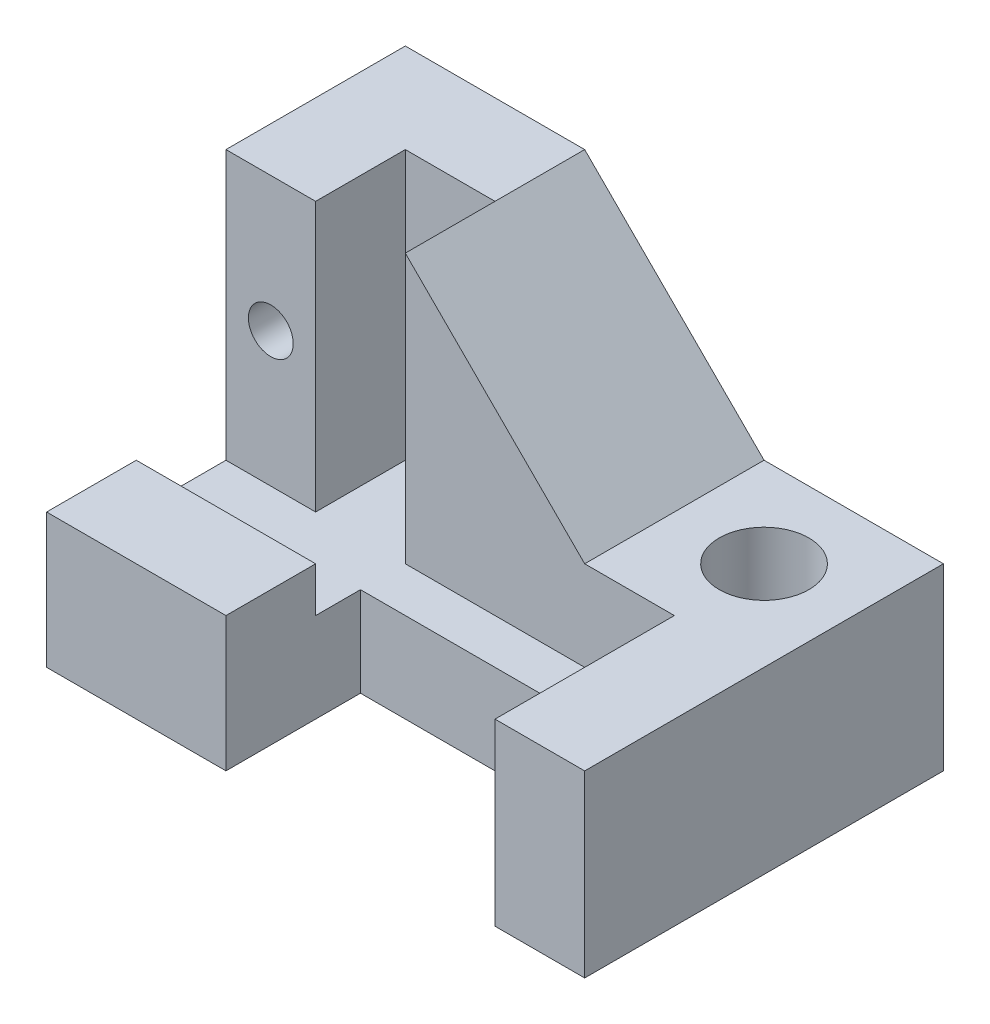
ISO-10303-21;
HEADER;
FILE_DESCRIPTION(('STEP AP214'),'2;1');
FILE_NAME('part.step','',(''),(''),'','','');
FILE_SCHEMA(('AUTOMOTIVE_DESIGN { 1 0 10303 214 1 1 1 1 }'));
ENDSEC;
DATA;
#1=APPLICATION_CONTEXT('core data for automotive mechanical design processes');
#2=APPLICATION_PROTOCOL_DEFINITION('international standard','automotive_design',2000,#1);
#3=PRODUCT_CONTEXT('',#1,'mechanical');
#4=PRODUCT('Part','Part','',(#3));
#5=PRODUCT_RELATED_PRODUCT_CATEGORY('part','',(#4));
#6=PRODUCT_DEFINITION_FORMATION('','',#4);
#7=PRODUCT_DEFINITION_CONTEXT('part definition',#1,'design');
#8=PRODUCT_DEFINITION('design','',#6,#7);
#9=PRODUCT_DEFINITION_SHAPE('','',#8);
#10=(LENGTH_UNIT() NAMED_UNIT(*) SI_UNIT(.MILLI.,.METRE.));
#11=(NAMED_UNIT(*) PLANE_ANGLE_UNIT() SI_UNIT($,.RADIAN.));
#12=(NAMED_UNIT(*) SI_UNIT($,.STERADIAN.) SOLID_ANGLE_UNIT());
#13=UNCERTAINTY_MEASURE_WITH_UNIT(LENGTH_MEASURE(1.E-05),#10,'distance_accuracy_value','');
#14=(GEOMETRIC_REPRESENTATION_CONTEXT(3) GLOBAL_UNCERTAINTY_ASSIGNED_CONTEXT((#13)) GLOBAL_UNIT_ASSIGNED_CONTEXT((#10,
#11,#12)) REPRESENTATION_CONTEXT('',''));
#15=CARTESIAN_POINT('',(0.,0.,0.));
#16=DIRECTION('',(0.,0.,1.));
#17=DIRECTION('',(1.,0.,0.));
#18=AXIS2_PLACEMENT_3D('',#15,#16,#17);
#19=CARTESIAN_POINT('',(0.,0.5,0.));
#20=DIRECTION('',(0.,0.,-1.));
#21=DIRECTION('',(-1.,0.,0.));
#22=AXIS2_PLACEMENT_3D('',#19,#20,#21);
#23=PLANE('',#22);
#24=DIRECTION('',(0.,1.,0.));
#25=VECTOR('',#24,1.);
#26=CARTESIAN_POINT('',(1.,0.,0.));
#27=LINE('',#26,#25);
#28=CARTESIAN_POINT('',(1.,0.,0.));
#29=VERTEX_POINT('',#28);
#30=CARTESIAN_POINT('',(1.,0.75,0.));
#31=VERTEX_POINT('',#30);
#32=EDGE_CURVE('E289',#29,#31,#27,.T.);
#33=ORIENTED_EDGE('',*,*,#32,.T.);
#34=DIRECTION('',(1.,0.,0.));
#35=VECTOR('',#34,1.);
#36=CARTESIAN_POINT('',(0.,0.75,0.));
#37=LINE('',#36,#35);
#38=CARTESIAN_POINT('',(0.,0.75,0.));
#39=VERTEX_POINT('',#38);
#40=EDGE_CURVE('E263',#39,#31,#37,.T.);
#41=ORIENTED_EDGE('',*,*,#40,.F.);
#42=DIRECTION('',(0.,-1.,0.));
#43=VECTOR('',#42,1.);
#44=CARTESIAN_POINT('',(0.,0.5,0.));
#45=LINE('',#44,#43);
#46=CARTESIAN_POINT('',(0.,0.,0.));
#47=VERTEX_POINT('',#46);
#48=EDGE_CURVE('E48',#39,#47,#45,.T.);
#49=ORIENTED_EDGE('',*,*,#48,.T.);
#50=DIRECTION('',(1.,0.,0.));
#51=VECTOR('',#50,1.);
#52=CARTESIAN_POINT('',(0.,0.,0.));
#53=LINE('',#52,#51);
#54=EDGE_CURVE('E318',#47,#29,#53,.T.);
#55=ORIENTED_EDGE('',*,*,#54,.T.);
#56=EDGE_LOOP('',(#33,#41,#49,#55));
#57=FACE_BOUND('',#56,.T.);
#58=ADVANCED_FACE('F39',(#57),#23,.F.);
#59=CARTESIAN_POINT('',(0.,0.5,0.));
#60=DIRECTION('',(0.,-1.,0.));
#61=DIRECTION('',(0.,0.,-1.));
#62=AXIS2_PLACEMENT_3D('',#59,#60,#61);
#63=PLANE('',#62);
#64=DIRECTION('',(-1.,0.,0.));
#65=VECTOR('',#64,1.);
#66=CARTESIAN_POINT('',(0.,0.5,-0.75));
#67=LINE('',#66,#65);
#68=CARTESIAN_POINT('',(2.5,0.5,-0.75));
#69=VERTEX_POINT('',#68);
#70=CARTESIAN_POINT('',(1.,0.5,-0.75));
#71=VERTEX_POINT('',#70);
#72=EDGE_CURVE('E292',#69,#71,#67,.T.);
#73=ORIENTED_EDGE('',*,*,#72,.F.);
#74=DIRECTION('',(0.,0.,-1.));
#75=VECTOR('',#74,1.);
#76=CARTESIAN_POINT('',(2.5,0.5,0.));
#77=LINE('',#76,#75);
#78=CARTESIAN_POINT('',(2.5,0.5,-1.));
#79=VERTEX_POINT('',#78);
#80=EDGE_CURVE('E219',#69,#79,#77,.T.);
#81=ORIENTED_EDGE('',*,*,#80,.T.);
#82=DIRECTION('',(1.,0.,0.));
#83=VECTOR('',#82,1.);
#84=CARTESIAN_POINT('',(0.,0.5,-1.));
#85=LINE('',#84,#83);
#86=CARTESIAN_POINT('',(1.,0.5,-1.));
#87=VERTEX_POINT('',#86);
#88=EDGE_CURVE('E62',#87,#79,#85,.T.);
#89=ORIENTED_EDGE('',*,*,#88,.F.);
#90=DIRECTION('',(0.,0.,1.));
#91=VECTOR('',#90,1.);
#92=CARTESIAN_POINT('',(1.,0.5,0.));
#93=LINE('',#92,#91);
#94=CARTESIAN_POINT('',(1.,0.5,-1.5));
#95=VERTEX_POINT('',#94);
#96=EDGE_CURVE('E213',#95,#87,#93,.T.);
#97=ORIENTED_EDGE('',*,*,#96,.F.);
#98=DIRECTION('',(1.,0.,0.));
#99=VECTOR('',#98,1.);
#100=CARTESIAN_POINT('',(0.,0.5,-1.5));
#101=LINE('',#100,#99);
#102=CARTESIAN_POINT('',(0.5,0.5,-1.5));
#103=VERTEX_POINT('',#102);
#104=EDGE_CURVE('E209',#103,#95,#101,.T.);
#105=ORIENTED_EDGE('',*,*,#104,.F.);
#106=DIRECTION('',(0.,0.,-1.));
#107=VECTOR('',#106,1.);
#108=CARTESIAN_POINT('',(0.5,0.5,0.));
#109=LINE('',#108,#107);
#110=CARTESIAN_POINT('',(0.5,0.5,-1.));
#111=VERTEX_POINT('',#110);
#112=EDGE_CURVE('E226',#111,#103,#109,.T.);
#113=ORIENTED_EDGE('',*,*,#112,.F.);
#114=DIRECTION('',(1.,0.,0.));
#115=VECTOR('',#114,1.);
#116=CARTESIAN_POINT('',(0.,0.5,-1.));
#117=LINE('',#116,#115);
#118=CARTESIAN_POINT('',(0.,0.5,-1.));
#119=VERTEX_POINT('',#118);
#120=EDGE_CURVE('E222',#119,#111,#117,.T.);
#121=ORIENTED_EDGE('',*,*,#120,.F.);
#122=DIRECTION('',(0.,0.,1.));
#123=VECTOR('',#122,1.);
#124=CARTESIAN_POINT('',(0.,0.5,0.));
#125=LINE('',#124,#123);
#126=CARTESIAN_POINT('',(0.,0.5,-0.5));
#127=VERTEX_POINT('',#126);
#128=EDGE_CURVE('E310',#119,#127,#125,.T.);
#129=ORIENTED_EDGE('',*,*,#128,.T.);
#130=DIRECTION('',(1.,0.,0.));
#131=VECTOR('',#130,1.);
#132=CARTESIAN_POINT('',(0.,0.5,-0.5));
#133=LINE('',#132,#131);
#134=CARTESIAN_POINT('',(1.,0.5,-0.5));
#135=VERTEX_POINT('',#134);
#136=EDGE_CURVE('E251',#127,#135,#133,.T.);
#137=ORIENTED_EDGE('',*,*,#136,.T.);
#138=DIRECTION('',(0.,0.,1.));
#139=VECTOR('',#138,1.);
#140=CARTESIAN_POINT('',(1.,0.5,0.));
#141=LINE('',#140,#139);
#142=EDGE_CURVE('E305',#71,#135,#141,.T.);
#143=ORIENTED_EDGE('',*,*,#142,.F.);
#144=EDGE_LOOP('',(#73,#81,#89,#97,#105,#113,#121,#129,#137,#143));
#145=FACE_BOUND('',#144,.T.);
#146=ADVANCED_FACE('F356',(#145),#63,.F.);
#147=CARTESIAN_POINT('',(0.,0.,0.));
#148=DIRECTION('',(0.,-1.,0.));
#149=DIRECTION('',(0.,0.,-1.));
#150=AXIS2_PLACEMENT_3D('',#147,#148,#149);
#151=PLANE('',#150);
#152=CARTESIAN_POINT('',(2.5,0.,-1.5));
#153=DIRECTION('',(0.,1.,0.));
#154=DIRECTION('',(0.,0.,1.));
#155=AXIS2_PLACEMENT_3D('',#152,#153,#154);
#156=CIRCLE('',#155,0.25);
#157=CARTESIAN_POINT('',(2.5,0.,-1.25));
#158=VERTEX_POINT('',#157);
#159=EDGE_CURVE('E446',#158,#158,#156,.T.);
#160=ORIENTED_EDGE('',*,*,#159,.T.);
#161=EDGE_LOOP('',(#160));
#162=FACE_BOUND('',#161,.T.);
#163=DIRECTION('',(1.,0.,0.));
#164=VECTOR('',#163,1.);
#165=CARTESIAN_POINT('',(0.,0.,-0.75));
#166=LINE('',#165,#164);
#167=CARTESIAN_POINT('',(1.,0.,-0.75));
#168=VERTEX_POINT('',#167);
#169=CARTESIAN_POINT('',(2.5,0.,-0.75));
#170=VERTEX_POINT('',#169);
#171=EDGE_CURVE('E281',#168,#170,#166,.T.);
#172=ORIENTED_EDGE('',*,*,#171,.F.);
#173=DIRECTION('',(0.,0.,-1.));
#174=VECTOR('',#173,1.);
#175=CARTESIAN_POINT('',(1.,0.,0.));
#176=LINE('',#175,#174);
#177=EDGE_CURVE('E285',#29,#168,#176,.T.);
#178=ORIENTED_EDGE('',*,*,#177,.F.);
#179=ORIENTED_EDGE('',*,*,#54,.F.);
#180=DIRECTION('',(0.,0.,1.));
#181=VECTOR('',#180,1.);
#182=CARTESIAN_POINT('',(0.,0.,0.));
#183=LINE('',#182,#181);
#184=CARTESIAN_POINT('',(0.,0.,-2.));
#185=VERTEX_POINT('',#184);
#186=EDGE_CURVE('E309',#185,#47,#183,.T.);
#187=ORIENTED_EDGE('',*,*,#186,.F.);
#188=DIRECTION('',(-1.,0.,0.));
#189=VECTOR('',#188,1.);
#190=CARTESIAN_POINT('',(0.,0.,-2.));
#191=LINE('',#190,#189);
#192=CARTESIAN_POINT('',(3.,0.,-2.));
#193=VERTEX_POINT('',#192);
#194=EDGE_CURVE('E313',#193,#185,#191,.T.);
#195=ORIENTED_EDGE('',*,*,#194,.F.);
#196=DIRECTION('',(0.,0.,-1.));
#197=VECTOR('',#196,1.);
#198=CARTESIAN_POINT('',(3.,0.,0.));
#199=LINE('',#198,#197);
#200=CARTESIAN_POINT('',(3.,0.,0.));
#201=VERTEX_POINT('',#200);
#202=EDGE_CURVE('E322',#201,#193,#199,.T.);
#203=ORIENTED_EDGE('',*,*,#202,.F.);
#204=CARTESIAN_POINT('',(2.5,0.,0.));
#205=VERTEX_POINT('',#204);
#206=EDGE_CURVE('E317',#205,#201,#53,.T.);
#207=ORIENTED_EDGE('',*,*,#206,.F.);
#208=DIRECTION('',(0.,0.,-1.));
#209=VECTOR('',#208,1.);
#210=CARTESIAN_POINT('',(2.5,0.,0.));
#211=LINE('',#210,#209);
#212=EDGE_CURVE('E277',#205,#170,#211,.T.);
#213=ORIENTED_EDGE('',*,*,#212,.T.);
#214=EDGE_LOOP('',(#172,#178,#179,#187,#195,#203,#207,#213));
#215=FACE_BOUND('',#214,.T.);
#216=ADVANCED_FACE('F345',(#162,#215),#151,.T.);
#217=CARTESIAN_POINT('',(0.,0.5,0.));
#218=DIRECTION('',(1.,0.,0.));
#219=DIRECTION('',(0.,0.,-1.));
#220=AXIS2_PLACEMENT_3D('',#217,#218,#219);
#221=PLANE('',#220);
#222=ORIENTED_EDGE('',*,*,#186,.T.);
#223=ORIENTED_EDGE('',*,*,#48,.F.);
#224=DIRECTION('',(0.,0.,-1.));
#225=VECTOR('',#224,1.);
#226=CARTESIAN_POINT('',(0.,0.75,0.));
#227=LINE('',#226,#225);
#228=CARTESIAN_POINT('',(0.,0.75,-0.5));
#229=VERTEX_POINT('',#228);
#230=EDGE_CURVE('E259',#39,#229,#227,.T.);
#231=ORIENTED_EDGE('',*,*,#230,.T.);
#232=DIRECTION('',(0.,-1.,0.));
#233=VECTOR('',#232,1.);
#234=CARTESIAN_POINT('',(0.,0.75,-0.5));
#235=LINE('',#234,#233);
#236=EDGE_CURVE('E267',#229,#127,#235,.T.);
#237=ORIENTED_EDGE('',*,*,#236,.T.);
#238=ORIENTED_EDGE('',*,*,#128,.F.);
#239=DIRECTION('',(0.,-1.,0.));
#240=VECTOR('',#239,1.);
#241=CARTESIAN_POINT('',(0.,2.,-1.));
#242=LINE('',#241,#240);
#243=CARTESIAN_POINT('',(0.,2.,-1.));
#244=VERTEX_POINT('',#243);
#245=EDGE_CURVE('E237',#244,#119,#242,.T.);
#246=ORIENTED_EDGE('',*,*,#245,.F.);
#247=DIRECTION('',(0.,0.,1.));
#248=VECTOR('',#247,1.);
#249=CARTESIAN_POINT('',(0.,2.,0.));
#250=LINE('',#249,#248);
#251=CARTESIAN_POINT('',(0.,2.,-2.));
#252=VERTEX_POINT('',#251);
#253=EDGE_CURVE('E193',#252,#244,#250,.T.);
#254=ORIENTED_EDGE('',*,*,#253,.F.);
#255=DIRECTION('',(0.,-1.,0.));
#256=VECTOR('',#255,1.);
#257=CARTESIAN_POINT('',(0.,0.5,-2.));
#258=LINE('',#257,#256);
#259=EDGE_CURVE('E190',#252,#185,#258,.T.);
#260=ORIENTED_EDGE('',*,*,#259,.T.);
#261=EDGE_LOOP('',(#222,#223,#231,#237,#238,#246,#254,#260));
#262=FACE_BOUND('',#261,.T.);
#263=ADVANCED_FACE('F41',(#262),#221,.F.);
#264=DIRECTION('',(0.,-1.,0.));
#265=VECTOR('',#264,1.);
#266=CARTESIAN_POINT('',(3.,0.5,0.));
#267=LINE('',#266,#265);
#268=CARTESIAN_POINT('',(3.,1.00000000000003,0.));
#269=VERTEX_POINT('',#268);
#270=EDGE_CURVE('E333',#269,#201,#267,.T.);
#271=ORIENTED_EDGE('',*,*,#270,.F.);
#272=DIRECTION('',(1.,0.,0.));
#273=VECTOR('',#272,1.);
#274=CARTESIAN_POINT('',(2.,1.00000000000003,0.));
#275=LINE('',#274,#273);
#276=CARTESIAN_POINT('',(2.5,1.00000000000003,0.));
#277=VERTEX_POINT('',#276);
#278=EDGE_CURVE('E176',#277,#269,#275,.T.);
#279=ORIENTED_EDGE('',*,*,#278,.F.);
#280=DIRECTION('',(0.,1.,0.));
#281=VECTOR('',#280,1.);
#282=CARTESIAN_POINT('',(2.5,0.,0.));
#283=LINE('',#282,#281);
#284=EDGE_CURVE('E288',#205,#277,#283,.T.);
#285=ORIENTED_EDGE('',*,*,#284,.F.);
#286=ORIENTED_EDGE('',*,*,#206,.T.);
#287=EDGE_LOOP('',(#271,#279,#285,#286));
#288=FACE_BOUND('',#287,.T.);
#289=ADVANCED_FACE('F364',(#288),#23,.F.);
#290=CARTESIAN_POINT('',(3.,0.5,0.));
#291=DIRECTION('',(-1.,0.,0.));
#292=DIRECTION('',(0.,0.,1.));
#293=AXIS2_PLACEMENT_3D('',#290,#291,#292);
#294=PLANE('',#293);
#295=DIRECTION('',(0.,-1.,0.));
#296=VECTOR('',#295,1.);
#297=CARTESIAN_POINT('',(3.,0.5,-2.));
#298=LINE('',#297,#296);
#299=CARTESIAN_POINT('',(3.,1.00000000000003,-2.));
#300=VERTEX_POINT('',#299);
#301=EDGE_CURVE('E330',#300,#193,#298,.T.);
#302=ORIENTED_EDGE('',*,*,#301,.F.);
#303=DIRECTION('',(0.,0.,1.));
#304=VECTOR('',#303,1.);
#305=CARTESIAN_POINT('',(3.,1.00000000000003,-2.));
#306=LINE('',#305,#304);
#307=EDGE_CURVE('E370',#300,#269,#306,.T.);
#308=ORIENTED_EDGE('',*,*,#307,.T.);
#309=ORIENTED_EDGE('',*,*,#270,.T.);
#310=ORIENTED_EDGE('',*,*,#202,.T.);
#311=EDGE_LOOP('',(#302,#308,#309,#310));
#312=FACE_BOUND('',#311,.T.);
#313=ADVANCED_FACE('F368',(#312),#294,.F.);
#314=CARTESIAN_POINT('',(0.,0.5,-2.));
#315=DIRECTION('',(0.,0.,1.));
#316=DIRECTION('',(1.,0.,0.));
#317=AXIS2_PLACEMENT_3D('',#314,#315,#316);
#318=PLANE('',#317);
#319=CARTESIAN_POINT('',(0.25,1.25,-2.));
#320=DIRECTION('',(0.,0.,1.));
#321=DIRECTION('',(1.,0.,0.));
#322=AXIS2_PLACEMENT_3D('',#319,#320,#321);
#323=CIRCLE('',#322,0.125);
#324=CARTESIAN_POINT('',(0.375,1.25,-2.));
#325=VERTEX_POINT('',#324);
#326=EDGE_CURVE('E437',#325,#325,#323,.T.);
#327=ORIENTED_EDGE('',*,*,#326,.T.);
#328=EDGE_LOOP('',(#327));
#329=FACE_BOUND('',#328,.T.);
#330=DIRECTION('',(0.707106781186556,-0.707106781186539,0.));
#331=VECTOR('',#330,1.);
#332=CARTESIAN_POINT('',(1.,2.,-2.));
#333=LINE('',#332,#331);
#334=CARTESIAN_POINT('',(1.,2.,-2.));
#335=VERTEX_POINT('',#334);
#336=CARTESIAN_POINT('',(2.,1.00000000000003,-2.));
#337=VERTEX_POINT('',#336);
#338=EDGE_CURVE('E163',#335,#337,#333,.T.);
#339=ORIENTED_EDGE('',*,*,#338,.T.);
#340=DIRECTION('',(1.,0.,0.));
#341=VECTOR('',#340,1.);
#342=CARTESIAN_POINT('',(2.,1.00000000000003,-2.));
#343=LINE('',#342,#341);
#344=EDGE_CURVE('E175',#337,#300,#343,.T.);
#345=ORIENTED_EDGE('',*,*,#344,.T.);
#346=ORIENTED_EDGE('',*,*,#301,.T.);
#347=ORIENTED_EDGE('',*,*,#194,.T.);
#348=ORIENTED_EDGE('',*,*,#259,.F.);
#349=DIRECTION('',(-1.,0.,0.));
#350=VECTOR('',#349,1.);
#351=CARTESIAN_POINT('',(0.,2.,-2.));
#352=LINE('',#351,#350);
#353=EDGE_CURVE('E181',#335,#252,#352,.T.);
#354=ORIENTED_EDGE('',*,*,#353,.F.);
#355=EDGE_LOOP('',(#339,#345,#346,#347,#348,#354));
#356=FACE_BOUND('',#355,.T.);
#357=ADVANCED_FACE('F188',(#329,#356),#318,.F.);
#358=CARTESIAN_POINT('',(1.,0.,0.));
#359=DIRECTION('',(1.,0.,0.));
#360=DIRECTION('',(0.,0.,-1.));
#361=AXIS2_PLACEMENT_3D('',#358,#359,#360);
#362=PLANE('',#361);
#363=ORIENTED_EDGE('',*,*,#142,.T.);
#364=DIRECTION('',(0.,-1.,0.));
#365=VECTOR('',#364,1.);
#366=CARTESIAN_POINT('',(1.,0.75,-0.5));
#367=LINE('',#366,#365);
#368=CARTESIAN_POINT('',(1.,0.75,-0.5));
#369=VERTEX_POINT('',#368);
#370=EDGE_CURVE('E274',#369,#135,#367,.T.);
#371=ORIENTED_EDGE('',*,*,#370,.F.);
#372=DIRECTION('',(0.,0.,-1.));
#373=VECTOR('',#372,1.);
#374=CARTESIAN_POINT('',(1.,0.75,0.));
#375=LINE('',#374,#373);
#376=EDGE_CURVE('E252',#31,#369,#375,.T.);
#377=ORIENTED_EDGE('',*,*,#376,.F.);
#378=ORIENTED_EDGE('',*,*,#32,.F.);
#379=ORIENTED_EDGE('',*,*,#177,.T.);
#380=DIRECTION('',(0.,1.,0.));
#381=VECTOR('',#380,1.);
#382=CARTESIAN_POINT('',(1.,0.,-0.75));
#383=LINE('',#382,#381);
#384=EDGE_CURVE('E293',#168,#71,#383,.T.);
#385=ORIENTED_EDGE('',*,*,#384,.T.);
#386=EDGE_LOOP('',(#363,#371,#377,#378,#379,#385));
#387=FACE_BOUND('',#386,.T.);
#388=ADVANCED_FACE('F350',(#387),#362,.T.);
#389=CARTESIAN_POINT('',(0.,0.,-0.75));
#390=DIRECTION('',(0.,0.,1.));
#391=DIRECTION('',(1.,0.,0.));
#392=AXIS2_PLACEMENT_3D('',#389,#390,#391);
#393=PLANE('',#392);
#394=ORIENTED_EDGE('',*,*,#72,.T.);
#395=ORIENTED_EDGE('',*,*,#384,.F.);
#396=ORIENTED_EDGE('',*,*,#171,.T.);
#397=DIRECTION('',(0.,1.,0.));
#398=VECTOR('',#397,1.);
#399=CARTESIAN_POINT('',(2.5,0.,-0.75));
#400=LINE('',#399,#398);
#401=EDGE_CURVE('E297',#170,#69,#400,.T.);
#402=ORIENTED_EDGE('',*,*,#401,.T.);
#403=EDGE_LOOP('',(#394,#395,#396,#402));
#404=FACE_BOUND('',#403,.T.);
#405=ADVANCED_FACE('F354',(#404),#393,.T.);
#406=CARTESIAN_POINT('',(2.5,0.,0.));
#407=DIRECTION('',(1.,0.,0.));
#408=DIRECTION('',(0.,0.,-1.));
#409=AXIS2_PLACEMENT_3D('',#406,#407,#408);
#410=PLANE('',#409);
#411=ORIENTED_EDGE('',*,*,#284,.T.);
#412=DIRECTION('',(0.,0.,-1.));
#413=VECTOR('',#412,1.);
#414=CARTESIAN_POINT('',(2.5,1.00000000000003,0.));
#415=LINE('',#414,#413);
#416=CARTESIAN_POINT('',(2.5,1.00000000000003,-1.));
#417=VERTEX_POINT('',#416);
#418=EDGE_CURVE('E214',#277,#417,#415,.T.);
#419=ORIENTED_EDGE('',*,*,#418,.T.);
#420=DIRECTION('',(0.,-1.,0.));
#421=VECTOR('',#420,1.);
#422=CARTESIAN_POINT('',(2.5,2.,-1.));
#423=LINE('',#422,#421);
#424=EDGE_CURVE('E55',#417,#79,#423,.T.);
#425=ORIENTED_EDGE('',*,*,#424,.T.);
#426=ORIENTED_EDGE('',*,*,#80,.F.);
#427=ORIENTED_EDGE('',*,*,#401,.F.);
#428=ORIENTED_EDGE('',*,*,#212,.F.);
#429=EDGE_LOOP('',(#411,#419,#425,#426,#427,#428));
#430=FACE_BOUND('',#429,.T.);
#431=ADVANCED_FACE('F357',(#430),#410,.F.);
#432=CARTESIAN_POINT('',(0.,0.75,-0.5));
#433=DIRECTION('',(0.,0.,-1.));
#434=DIRECTION('',(-1.,0.,0.));
#435=AXIS2_PLACEMENT_3D('',#432,#433,#434);
#436=PLANE('',#435);
#437=ORIENTED_EDGE('',*,*,#136,.F.);
#438=ORIENTED_EDGE('',*,*,#236,.F.);
#439=DIRECTION('',(1.,0.,0.));
#440=VECTOR('',#439,1.);
#441=CARTESIAN_POINT('',(0.,0.75,-0.5));
#442=LINE('',#441,#440);
#443=EDGE_CURVE('E255',#229,#369,#442,.T.);
#444=ORIENTED_EDGE('',*,*,#443,.T.);
#445=ORIENTED_EDGE('',*,*,#370,.T.);
#446=EDGE_LOOP('',(#437,#438,#444,#445));
#447=FACE_BOUND('',#446,.T.);
#448=ADVANCED_FACE('F405',(#447),#436,.T.);
#449=CARTESIAN_POINT('',(0.,0.75,0.));
#450=DIRECTION('',(0.,-1.,0.));
#451=DIRECTION('',(0.,0.,-1.));
#452=AXIS2_PLACEMENT_3D('',#449,#450,#451);
#453=PLANE('',#452);
#454=ORIENTED_EDGE('',*,*,#376,.T.);
#455=ORIENTED_EDGE('',*,*,#443,.F.);
#456=ORIENTED_EDGE('',*,*,#230,.F.);
#457=ORIENTED_EDGE('',*,*,#40,.T.);
#458=EDGE_LOOP('',(#454,#455,#456,#457));
#459=FACE_BOUND('',#458,.T.);
#460=ADVANCED_FACE('F398',(#459),#453,.F.);
#461=CARTESIAN_POINT('',(0.,2.,-1.5));
#462=DIRECTION('',(0.,0.,-1.));
#463=DIRECTION('',(-1.,0.,0.));
#464=AXIS2_PLACEMENT_3D('',#461,#462,#463);
#465=PLANE('',#464);
#466=ORIENTED_EDGE('',*,*,#104,.T.);
#467=DIRECTION('',(0.,-1.,0.));
#468=VECTOR('',#467,1.);
#469=CARTESIAN_POINT('',(1.,2.,-1.5));
#470=LINE('',#469,#468);
#471=CARTESIAN_POINT('',(1.,2.,-1.5));
#472=VERTEX_POINT('',#471);
#473=EDGE_CURVE('E247',#472,#95,#470,.T.);
#474=ORIENTED_EDGE('',*,*,#473,.F.);
#475=DIRECTION('',(1.,0.,0.));
#476=VECTOR('',#475,1.);
#477=CARTESIAN_POINT('',(0.,2.,-1.5));
#478=LINE('',#477,#476);
#479=CARTESIAN_POINT('',(0.5,2.,-1.5));
#480=VERTEX_POINT('',#479);
#481=EDGE_CURVE('E184',#480,#472,#478,.T.);
#482=ORIENTED_EDGE('',*,*,#481,.F.);
#483=DIRECTION('',(0.,-1.,0.));
#484=VECTOR('',#483,1.);
#485=CARTESIAN_POINT('',(0.5,2.,-1.5));
#486=LINE('',#485,#484);
#487=EDGE_CURVE('E208',#480,#103,#486,.T.);
#488=ORIENTED_EDGE('',*,*,#487,.T.);
#489=EDGE_LOOP('',(#466,#474,#482,#488));
#490=FACE_BOUND('',#489,.T.);
#491=ADVANCED_FACE('F396',(#490),#465,.F.);
#492=CARTESIAN_POINT('',(1.,2.,0.));
#493=DIRECTION('',(1.,0.,0.));
#494=DIRECTION('',(0.,0.,-1.));
#495=AXIS2_PLACEMENT_3D('',#492,#493,#494);
#496=PLANE('',#495);
#497=ORIENTED_EDGE('',*,*,#96,.T.);
#498=DIRECTION('',(0.,-1.,0.));
#499=VECTOR('',#498,1.);
#500=CARTESIAN_POINT('',(1.,2.,-1.));
#501=LINE('',#500,#499);
#502=CARTESIAN_POINT('',(1.,2.,-1.));
#503=VERTEX_POINT('',#502);
#504=EDGE_CURVE('E243',#503,#87,#501,.T.);
#505=ORIENTED_EDGE('',*,*,#504,.F.);
#506=DIRECTION('',(0.,0.,1.));
#507=VECTOR('',#506,1.);
#508=CARTESIAN_POINT('',(1.,2.,0.));
#509=LINE('',#508,#507);
#510=EDGE_CURVE('E194',#472,#503,#509,.T.);
#511=ORIENTED_EDGE('',*,*,#510,.F.);
#512=ORIENTED_EDGE('',*,*,#473,.T.);
#513=EDGE_LOOP('',(#497,#505,#511,#512));
#514=FACE_BOUND('',#513,.T.);
#515=ADVANCED_FACE('F389',(#514),#496,.F.);
#516=CARTESIAN_POINT('',(0.,2.,-1.));
#517=DIRECTION('',(0.,0.,-1.));
#518=DIRECTION('',(-1.,0.,0.));
#519=AXIS2_PLACEMENT_3D('',#516,#517,#518);
#520=PLANE('',#519);
#521=ORIENTED_EDGE('',*,*,#424,.F.);
#522=DIRECTION('',(-1.,0.,0.));
#523=VECTOR('',#522,1.);
#524=CARTESIAN_POINT('',(0.,1.00000000000003,-1.));
#525=LINE('',#524,#523);
#526=CARTESIAN_POINT('',(2.,1.00000000000003,-1.));
#527=VERTEX_POINT('',#526);
#528=EDGE_CURVE('E11',#417,#527,#525,.T.);
#529=ORIENTED_EDGE('',*,*,#528,.T.);
#530=DIRECTION('',(-0.707106781186556,0.707106781186539,0.));
#531=VECTOR('',#530,1.);
#532=CARTESIAN_POINT('',(0.499999999999988,2.5,-1.));
#533=LINE('',#532,#531);
#534=EDGE_CURVE('E373',#527,#503,#533,.T.);
#535=ORIENTED_EDGE('',*,*,#534,.T.);
#536=ORIENTED_EDGE('',*,*,#504,.T.);
#537=ORIENTED_EDGE('',*,*,#88,.T.);
#538=EDGE_LOOP('',(#521,#529,#535,#536,#537));
#539=FACE_BOUND('',#538,.T.);
#540=ADVANCED_FACE('F386',(#539),#520,.F.);
#541=CARTESIAN_POINT('',(0.,2.,-1.));
#542=DIRECTION('',(0.,0.,-1.));
#543=DIRECTION('',(-1.,0.,0.));
#544=AXIS2_PLACEMENT_3D('',#541,#542,#543);
#545=PLANE('',#544);
#546=CARTESIAN_POINT('',(0.25,1.25,-1.));
#547=DIRECTION('',(0.,0.,1.));
#548=DIRECTION('',(1.,0.,0.));
#549=AXIS2_PLACEMENT_3D('',#546,#547,#548);
#550=CIRCLE('',#549,0.125);
#551=CARTESIAN_POINT('',(0.375,1.25,-1.));
#552=VERTEX_POINT('',#551);
#553=EDGE_CURVE('E441',#552,#552,#550,.T.);
#554=ORIENTED_EDGE('',*,*,#553,.F.);
#555=EDGE_LOOP('',(#554));
#556=FACE_BOUND('',#555,.T.);
#557=ORIENTED_EDGE('',*,*,#120,.T.);
#558=DIRECTION('',(0.,-1.,0.));
#559=VECTOR('',#558,1.);
#560=CARTESIAN_POINT('',(0.5,2.,-1.));
#561=LINE('',#560,#559);
#562=CARTESIAN_POINT('',(0.5,2.,-1.));
#563=VERTEX_POINT('',#562);
#564=EDGE_CURVE('E233',#563,#111,#561,.T.);
#565=ORIENTED_EDGE('',*,*,#564,.F.);
#566=DIRECTION('',(1.,0.,0.));
#567=VECTOR('',#566,1.);
#568=CARTESIAN_POINT('',(0.,2.,-1.));
#569=LINE('',#568,#567);
#570=EDGE_CURVE('E198',#244,#563,#569,.T.);
#571=ORIENTED_EDGE('',*,*,#570,.F.);
#572=ORIENTED_EDGE('',*,*,#245,.T.);
#573=EDGE_LOOP('',(#557,#565,#571,#572));
#574=FACE_BOUND('',#573,.T.);
#575=ADVANCED_FACE('F470',(#556,#574),#545,.F.);
#576=CARTESIAN_POINT('',(0.5,2.,0.));
#577=DIRECTION('',(-1.,0.,0.));
#578=DIRECTION('',(0.,0.,1.));
#579=AXIS2_PLACEMENT_3D('',#576,#577,#578);
#580=PLANE('',#579);
#581=ORIENTED_EDGE('',*,*,#112,.T.);
#582=ORIENTED_EDGE('',*,*,#487,.F.);
#583=DIRECTION('',(0.,0.,-1.));
#584=VECTOR('',#583,1.);
#585=CARTESIAN_POINT('',(0.5,2.,0.));
#586=LINE('',#585,#584);
#587=EDGE_CURVE('E205',#563,#480,#586,.T.);
#588=ORIENTED_EDGE('',*,*,#587,.F.);
#589=ORIENTED_EDGE('',*,*,#564,.T.);
#590=EDGE_LOOP('',(#581,#582,#588,#589));
#591=FACE_BOUND('',#590,.T.);
#592=ADVANCED_FACE('F393',(#591),#580,.F.);
#593=CARTESIAN_POINT('',(0.,2.,0.));
#594=DIRECTION('',(0.,1.,0.));
#595=DIRECTION('',(0.,0.,1.));
#596=AXIS2_PLACEMENT_3D('',#593,#594,#595);
#597=PLANE('',#596);
#598=DIRECTION('',(0.,0.,1.));
#599=VECTOR('',#598,1.);
#600=CARTESIAN_POINT('',(1.,2.,-2.));
#601=LINE('',#600,#599);
#602=EDGE_CURVE('E166',#335,#472,#601,.T.);
#603=ORIENTED_EDGE('',*,*,#602,.F.);
#604=ORIENTED_EDGE('',*,*,#353,.T.);
#605=ORIENTED_EDGE('',*,*,#253,.T.);
#606=ORIENTED_EDGE('',*,*,#570,.T.);
#607=ORIENTED_EDGE('',*,*,#587,.T.);
#608=ORIENTED_EDGE('',*,*,#481,.T.);
#609=EDGE_LOOP('',(#603,#604,#605,#606,#607,#608));
#610=FACE_BOUND('',#609,.T.);
#611=ADVANCED_FACE('F180',(#610),#597,.T.);
#612=CARTESIAN_POINT('',(2.,1.00000000000003,-2.));
#613=DIRECTION('',(0.,-1.,0.));
#614=DIRECTION('',(0.,0.,-1.));
#615=AXIS2_PLACEMENT_3D('',#612,#613,#614);
#616=PLANE('',#615);
#617=CARTESIAN_POINT('',(2.5,1.00000000000003,-1.5));
#618=DIRECTION('',(0.,1.,0.));
#619=DIRECTION('',(0.,0.,1.));
#620=AXIS2_PLACEMENT_3D('',#617,#618,#619);
#621=CIRCLE('',#620,0.25);
#622=CARTESIAN_POINT('',(2.5,1.00000000000003,-1.25));
#623=VERTEX_POINT('',#622);
#624=EDGE_CURVE('E440',#623,#623,#621,.T.);
#625=ORIENTED_EDGE('',*,*,#624,.F.);
#626=EDGE_LOOP('',(#625));
#627=FACE_BOUND('',#626,.T.);
#628=ORIENTED_EDGE('',*,*,#278,.T.);
#629=ORIENTED_EDGE('',*,*,#307,.F.);
#630=ORIENTED_EDGE('',*,*,#344,.F.);
#631=DIRECTION('',(0.,0.,1.));
#632=VECTOR('',#631,1.);
#633=CARTESIAN_POINT('',(2.,1.00000000000003,-2.));
#634=LINE('',#633,#632);
#635=EDGE_CURVE('E169',#337,#527,#634,.T.);
#636=ORIENTED_EDGE('',*,*,#635,.T.);
#637=ORIENTED_EDGE('',*,*,#528,.F.);
#638=ORIENTED_EDGE('',*,*,#418,.F.);
#639=EDGE_LOOP('',(#628,#629,#630,#636,#637,#638));
#640=FACE_BOUND('',#639,.T.);
#641=ADVANCED_FACE('F453',(#627,#640),#616,.F.);
#642=CARTESIAN_POINT('',(1.,2.,-2.));
#643=DIRECTION('',(-0.707106781186539,-0.707106781186556,0.));
#644=DIRECTION('',(0.707106781186556,-0.707106781186539,0.));
#645=AXIS2_PLACEMENT_3D('',#642,#643,#644);
#646=PLANE('',#645);
#647=ORIENTED_EDGE('',*,*,#635,.F.);
#648=ORIENTED_EDGE('',*,*,#338,.F.);
#649=ORIENTED_EDGE('',*,*,#602,.T.);
#650=ORIENTED_EDGE('',*,*,#510,.T.);
#651=ORIENTED_EDGE('',*,*,#534,.F.);
#652=EDGE_LOOP('',(#647,#648,#649,#650,#651));
#653=FACE_BOUND('',#652,.T.);
#654=ADVANCED_FACE('F165',(#653),#646,.F.);
#655=CARTESIAN_POINT('',(2.5,0.,-1.5));
#656=DIRECTION('',(0.,1.,0.));
#657=DIRECTION('',(0.,0.,1.));
#658=AXIS2_PLACEMENT_3D('',#655,#656,#657);
#659=CYLINDRICAL_SURFACE('',#658,0.25);
#660=ORIENTED_EDGE('',*,*,#159,.F.);
#661=EDGE_LOOP('',(#660));
#662=FACE_BOUND('',#661,.T.);
#663=ORIENTED_EDGE('',*,*,#624,.T.);
#664=EDGE_LOOP('',(#663));
#665=FACE_BOUND('',#664,.T.);
#666=ADVANCED_FACE('F461',(#662,#665),#659,.F.);
#667=CARTESIAN_POINT('',(0.25,1.25,-2.));
#668=DIRECTION('',(0.,0.,1.));
#669=DIRECTION('',(1.,0.,0.));
#670=AXIS2_PLACEMENT_3D('',#667,#668,#669);
#671=CYLINDRICAL_SURFACE('',#670,0.125);
#672=ORIENTED_EDGE('',*,*,#326,.F.);
#673=EDGE_LOOP('',(#672));
#674=FACE_BOUND('',#673,.T.);
#675=ORIENTED_EDGE('',*,*,#553,.T.);
#676=EDGE_LOOP('',(#675));
#677=FACE_BOUND('',#676,.T.);
#678=ADVANCED_FACE('F518',(#674,#677),#671,.F.);
#679=CLOSED_SHELL('',(#58,#146,#216,#263,#289,#313,#357,#388,#405,#431,#448,#460,#491,#515,#540,
#575,#592,#611,#641,#654,#666,#678));
#680=MANIFOLD_SOLID_BREP('B2',#679);
#681=ADVANCED_BREP_SHAPE_REPRESENTATION('',(#18,#680),#14);
#682=SHAPE_DEFINITION_REPRESENTATION(#9,#681);
ENDSEC;
END-ISO-10303-21;
